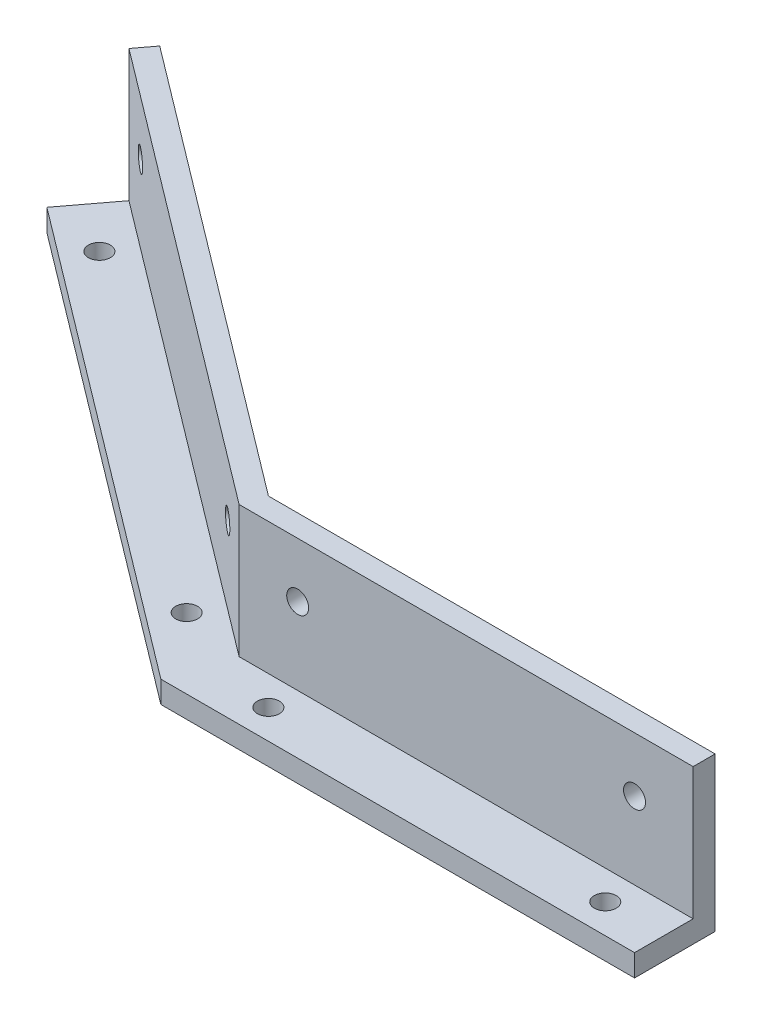
ISO-10303-21;
HEADER;
FILE_DESCRIPTION(('STEP AP214'),'2;1');
FILE_NAME('part.step','',(''),(''),'','','');
FILE_SCHEMA(('AUTOMOTIVE_DESIGN { 1 0 10303 214 1 1 1 1 }'));
ENDSEC;
DATA;
#1=APPLICATION_CONTEXT('core data for automotive mechanical design processes');
#2=APPLICATION_PROTOCOL_DEFINITION('international standard','automotive_design',2000,#1);
#3=PRODUCT_CONTEXT('',#1,'mechanical');
#4=PRODUCT('Part','Part','',(#3));
#5=PRODUCT_RELATED_PRODUCT_CATEGORY('part','',(#4));
#6=PRODUCT_DEFINITION_FORMATION('','',#4);
#7=PRODUCT_DEFINITION_CONTEXT('part definition',#1,'design');
#8=PRODUCT_DEFINITION('design','',#6,#7);
#9=PRODUCT_DEFINITION_SHAPE('','',#8);
#10=(LENGTH_UNIT() NAMED_UNIT(*) SI_UNIT(.MILLI.,.METRE.));
#11=(NAMED_UNIT(*) PLANE_ANGLE_UNIT() SI_UNIT($,.RADIAN.));
#12=(NAMED_UNIT(*) SI_UNIT($,.STERADIAN.) SOLID_ANGLE_UNIT());
#13=UNCERTAINTY_MEASURE_WITH_UNIT(LENGTH_MEASURE(1.E-05),#10,'distance_accuracy_value','');
#14=(GEOMETRIC_REPRESENTATION_CONTEXT(3) GLOBAL_UNCERTAINTY_ASSIGNED_CONTEXT((#13)) GLOBAL_UNIT_ASSIGNED_CONTEXT((#10,
#11,#12)) REPRESENTATION_CONTEXT('',''));
#15=CARTESIAN_POINT('',(0.,0.,0.));
#16=DIRECTION('',(0.,0.,1.));
#17=DIRECTION('',(1.,0.,0.));
#18=AXIS2_PLACEMENT_3D('',#15,#16,#17);
#19=CARTESIAN_POINT('',(0.,3.,0.));
#20=DIRECTION('',(-1.,0.,0.));
#21=DIRECTION('',(0.,0.,1.));
#22=AXIS2_PLACEMENT_3D('',#19,#20,#21);
#23=PLANE('',#22);
#24=DIRECTION('',(0.,0.,-1.));
#25=VECTOR('',#24,1.);
#26=CARTESIAN_POINT('',(0.,0.,0.));
#27=LINE('',#26,#25);
#28=CARTESIAN_POINT('',(0.,0.,8.));
#29=VERTEX_POINT('',#28);
#30=CARTESIAN_POINT('',(0.,0.,-3.));
#31=VERTEX_POINT('',#30);
#32=EDGE_CURVE('E108',#29,#31,#27,.T.);
#33=ORIENTED_EDGE('',*,*,#32,.T.);
#34=DIRECTION('',(0.,-1.,0.));
#35=VECTOR('',#34,1.);
#36=CARTESIAN_POINT('',(0.,21.,-3.));
#37=LINE('',#36,#35);
#38=CARTESIAN_POINT('',(0.,21.,-3.));
#39=VERTEX_POINT('',#38);
#40=EDGE_CURVE('E129',#39,#31,#37,.T.);
#41=ORIENTED_EDGE('',*,*,#40,.F.);
#42=DIRECTION('',(0.,0.,-1.));
#43=VECTOR('',#42,1.);
#44=CARTESIAN_POINT('',(0.,21.,-3.));
#45=LINE('',#44,#43);
#46=CARTESIAN_POINT('',(0.,21.,0.));
#47=VERTEX_POINT('',#46);
#48=EDGE_CURVE('E170',#47,#39,#45,.T.);
#49=ORIENTED_EDGE('',*,*,#48,.F.);
#50=DIRECTION('',(0.,-1.,0.));
#51=VECTOR('',#50,1.);
#52=CARTESIAN_POINT('',(0.,21.,0.));
#53=LINE('',#52,#51);
#54=CARTESIAN_POINT('',(0.,3.,0.));
#55=VERTEX_POINT('',#54);
#56=EDGE_CURVE('E138',#47,#55,#53,.T.);
#57=ORIENTED_EDGE('',*,*,#56,.T.);
#58=DIRECTION('',(0.,0.,-1.));
#59=VECTOR('',#58,1.);
#60=CARTESIAN_POINT('',(0.,3.,0.));
#61=LINE('',#60,#59);
#62=CARTESIAN_POINT('',(0.,3.,8.));
#63=VERTEX_POINT('',#62);
#64=EDGE_CURVE('E77',#63,#55,#61,.T.);
#65=ORIENTED_EDGE('',*,*,#64,.F.);
#66=DIRECTION('',(0.,-1.,0.));
#67=VECTOR('',#66,1.);
#68=CARTESIAN_POINT('',(0.,3.,8.));
#69=LINE('',#68,#67);
#70=EDGE_CURVE('E104',#63,#29,#69,.T.);
#71=ORIENTED_EDGE('',*,*,#70,.T.);
#72=EDGE_LOOP('',(#33,#41,#49,#57,#65,#71));
#73=FACE_BOUND('',#72,.T.);
#74=ADVANCED_FACE('F35',(#73),#23,.F.);
#75=CARTESIAN_POINT('',(-123.446373684317,3.,-46.4041287069077));
#76=DIRECTION('',(0.79800485304308,0.,0.602651022167633));
#77=DIRECTION('',(0.602651022167633,0.,-0.79800485304308));
#78=AXIS2_PLACEMENT_3D('',#75,#76,#77);
#79=PLANE('',#78);
#80=DIRECTION('',(-0.602651022167633,0.,0.79800485304308));
#81=VECTOR('',#80,1.);
#82=CARTESIAN_POINT('',(-123.446373684317,0.,-46.4041287069077));
#83=LINE('',#82,#81);
#84=CARTESIAN_POINT('',(-121.638420617814,0.,-48.7981432660369));
#85=VERTEX_POINT('',#84);
#86=CARTESIAN_POINT('',(-128.267581861658,0.,-40.020089882563));
#87=VERTEX_POINT('',#86);
#88=EDGE_CURVE('E101',#85,#87,#83,.T.);
#89=ORIENTED_EDGE('',*,*,#88,.T.);
#90=DIRECTION('',(0.,-1.,0.));
#91=VECTOR('',#90,1.);
#92=CARTESIAN_POINT('',(-128.267581861658,3.,-40.020089882563));
#93=LINE('',#92,#91);
#94=CARTESIAN_POINT('',(-128.267581861658,3.,-40.020089882563));
#95=VERTEX_POINT('',#94);
#96=EDGE_CURVE('E11',#95,#87,#93,.T.);
#97=ORIENTED_EDGE('',*,*,#96,.F.);
#98=DIRECTION('',(-0.602651022167633,0.,0.79800485304308));
#99=VECTOR('',#98,1.);
#100=CARTESIAN_POINT('',(-123.446373684317,3.,-46.4041287069077));
#101=LINE('',#100,#99);
#102=CARTESIAN_POINT('',(-123.446373684317,3.,-46.4041287069077));
#103=VERTEX_POINT('',#102);
#104=EDGE_CURVE('E87',#103,#95,#101,.T.);
#105=ORIENTED_EDGE('',*,*,#104,.F.);
#106=DIRECTION('',(0.,-1.,0.));
#107=VECTOR('',#106,1.);
#108=CARTESIAN_POINT('',(-123.446373684317,21.,-46.4041287069077));
#109=LINE('',#108,#107);
#110=CARTESIAN_POINT('',(-123.446373684317,21.,-46.4041287069077));
#111=VERTEX_POINT('',#110);
#112=EDGE_CURVE('E159',#111,#103,#109,.T.);
#113=ORIENTED_EDGE('',*,*,#112,.F.);
#114=DIRECTION('',(-0.602651022167628,0.,0.798004853043084));
#115=VECTOR('',#114,1.);
#116=CARTESIAN_POINT('',(-123.446373684317,21.,-46.4041287069077));
#117=LINE('',#116,#115);
#118=CARTESIAN_POINT('',(-121.638420617814,21.,-48.7981432660369));
#119=VERTEX_POINT('',#118);
#120=EDGE_CURVE('E177',#119,#111,#117,.T.);
#121=ORIENTED_EDGE('',*,*,#120,.F.);
#122=DIRECTION('',(0.,-1.,0.));
#123=VECTOR('',#122,1.);
#124=CARTESIAN_POINT('',(-121.638420617814,21.,-48.7981432660369));
#125=LINE('',#124,#123);
#126=EDGE_CURVE('E144',#119,#85,#125,.T.);
#127=ORIENTED_EDGE('',*,*,#126,.T.);
#128=EDGE_LOOP('',(#89,#97,#105,#113,#121,#127));
#129=FACE_BOUND('',#128,.T.);
#130=ADVANCED_FACE('F98',(#129),#79,.F.);
#131=CARTESIAN_POINT('',(-64.6814211147324,3.,8.));
#132=DIRECTION('',(0.602651022167632,0.,-0.79800485304308));
#133=DIRECTION('',(-0.79800485304308,0.,-0.602651022167632));
#134=AXIS2_PLACEMENT_3D('',#131,#132,#133);
#135=PLANE('',#134);
#136=DIRECTION('',(0.79800485304308,0.,0.602651022167632));
#137=VECTOR('',#136,1.);
#138=CARTESIAN_POINT('',(-64.6814211147324,0.,8.));
#139=LINE('',#138,#137);
#140=CARTESIAN_POINT('',(-64.6814211147324,0.,8.));
#141=VERTEX_POINT('',#140);
#142=EDGE_CURVE('E65',#87,#141,#139,.T.);
#143=ORIENTED_EDGE('',*,*,#142,.T.);
#144=DIRECTION('',(0.,-1.,0.));
#145=VECTOR('',#144,1.);
#146=CARTESIAN_POINT('',(-64.6814211147324,3.,8.));
#147=LINE('',#146,#145);
#148=CARTESIAN_POINT('',(-64.6814211147324,3.,8.));
#149=VERTEX_POINT('',#148);
#150=EDGE_CURVE('E43',#149,#141,#147,.T.);
#151=ORIENTED_EDGE('',*,*,#150,.F.);
#152=DIRECTION('',(0.79800485304308,0.,0.602651022167632));
#153=VECTOR('',#152,1.);
#154=CARTESIAN_POINT('',(-64.6814211147324,3.,8.));
#155=LINE('',#154,#153);
#156=EDGE_CURVE('E91',#95,#149,#155,.T.);
#157=ORIENTED_EDGE('',*,*,#156,.F.);
#158=ORIENTED_EDGE('',*,*,#96,.T.);
#159=EDGE_LOOP('',(#143,#151,#157,#158));
#160=FACE_BOUND('',#159,.T.);
#161=ADVANCED_FACE('F102',(#160),#135,.F.);
#162=CARTESIAN_POINT('',(0.,3.,8.));
#163=DIRECTION('',(0.,0.,-1.));
#164=DIRECTION('',(-1.,0.,0.));
#165=AXIS2_PLACEMENT_3D('',#162,#163,#164);
#166=PLANE('',#165);
#167=DIRECTION('',(1.,0.,0.));
#168=VECTOR('',#167,1.);
#169=CARTESIAN_POINT('',(0.,0.,8.));
#170=LINE('',#169,#168);
#171=EDGE_CURVE('E71',#141,#29,#170,.T.);
#172=ORIENTED_EDGE('',*,*,#171,.T.);
#173=ORIENTED_EDGE('',*,*,#70,.F.);
#174=DIRECTION('',(1.,0.,0.));
#175=VECTOR('',#174,1.);
#176=CARTESIAN_POINT('',(0.,3.,8.));
#177=LINE('',#176,#175);
#178=EDGE_CURVE('E51',#149,#63,#177,.T.);
#179=ORIENTED_EDGE('',*,*,#178,.F.);
#180=ORIENTED_EDGE('',*,*,#150,.T.);
#181=EDGE_LOOP('',(#172,#173,#179,#180));
#182=FACE_BOUND('',#181,.T.);
#183=ADVANCED_FACE('F115',(#182),#166,.F.);
#184=CARTESIAN_POINT('',(0.,3.,0.));
#185=DIRECTION('',(0.,-1.,0.));
#186=DIRECTION('',(0.,0.,-1.));
#187=AXIS2_PLACEMENT_3D('',#184,#185,#186);
#188=PLANE('',#187);
#189=CARTESIAN_POINT('',(-119.472938948643,3.,-38.3909011173943));
#190=DIRECTION('',(0.,1.,0.));
#191=DIRECTION('',(0.,0.,1.));
#192=AXIS2_PLACEMENT_3D('',#189,#190,#191);
#193=CIRCLE('',#192,1.5);
#194=CARTESIAN_POINT('',(-119.472938948643,3.,-36.8909011173943));
#195=VERTEX_POINT('',#194);
#196=EDGE_CURVE('E251',#195,#195,#193,.T.);
#197=ORIENTED_EDGE('',*,*,#196,.F.);
#198=EDGE_LOOP('',(#197));
#199=FACE_BOUND('',#198,.T.);
#200=CARTESIAN_POINT('',(-70.7946429130152,3.,-1.62918876516875));
#201=DIRECTION('',(0.,1.,0.));
#202=DIRECTION('',(0.,0.,1.));
#203=AXIS2_PLACEMENT_3D('',#200,#201,#202);
#204=CIRCLE('',#203,1.5);
#205=CARTESIAN_POINT('',(-70.7946429130152,3.,-0.129188765168755));
#206=VERTEX_POINT('',#205);
#207=EDGE_CURVE('E284',#206,#206,#204,.T.);
#208=ORIENTED_EDGE('',*,*,#207,.F.);
#209=EDGE_LOOP('',(#208));
#210=FACE_BOUND('',#209,.T.);
#211=CARTESIAN_POINT('',(-54.,3.,4.));
#212=DIRECTION('',(0.,1.,0.));
#213=DIRECTION('',(0.,0.,1.));
#214=AXIS2_PLACEMENT_3D('',#211,#212,#213);
#215=CIRCLE('',#214,1.5);
#216=CARTESIAN_POINT('',(-54.,3.,5.49999999999999));
#217=VERTEX_POINT('',#216);
#218=EDGE_CURVE('E278',#217,#217,#215,.T.);
#219=ORIENTED_EDGE('',*,*,#218,.F.);
#220=EDGE_LOOP('',(#219));
#221=FACE_BOUND('',#220,.T.);
#222=CARTESIAN_POINT('',(-8.,3.,4.));
#223=DIRECTION('',(0.,1.,0.));
#224=DIRECTION('',(0.,0.,1.));
#225=AXIS2_PLACEMENT_3D('',#222,#223,#224);
#226=CIRCLE('',#225,1.5);
#227=CARTESIAN_POINT('',(-8.,3.,5.5));
#228=VERTEX_POINT('',#227);
#229=EDGE_CURVE('E272',#228,#228,#226,.T.);
#230=ORIENTED_EDGE('',*,*,#229,.F.);
#231=EDGE_LOOP('',(#230));
#232=FACE_BOUND('',#231,.T.);
#233=ORIENTED_EDGE('',*,*,#64,.T.);
#234=DIRECTION('',(-1.,0.,0.));
#235=VECTOR('',#234,1.);
#236=CARTESIAN_POINT('',(0.,3.,0.));
#237=LINE('',#236,#235);
#238=CARTESIAN_POINT('',(-62.,3.,0.));
#239=VERTEX_POINT('',#238);
#240=EDGE_CURVE('E151',#55,#239,#237,.T.);
#241=ORIENTED_EDGE('',*,*,#240,.T.);
#242=DIRECTION('',(-0.79800485304308,0.,-0.602651022167632));
#243=VECTOR('',#242,1.);
#244=CARTESIAN_POINT('',(-62.,3.,0.));
#245=LINE('',#244,#243);
#246=EDGE_CURVE('E93',#239,#103,#245,.T.);
#247=ORIENTED_EDGE('',*,*,#246,.T.);
#248=ORIENTED_EDGE('',*,*,#104,.T.);
#249=ORIENTED_EDGE('',*,*,#156,.T.);
#250=ORIENTED_EDGE('',*,*,#178,.T.);
#251=EDGE_LOOP('',(#233,#241,#247,#248,#249,#250));
#252=FACE_BOUND('',#251,.T.);
#253=ADVANCED_FACE('F89',(#199,#210,#221,#232,#252),#188,.F.);
#254=CARTESIAN_POINT('',(0.,0.,0.));
#255=DIRECTION('',(0.,-1.,0.));
#256=DIRECTION('',(0.,0.,-1.));
#257=AXIS2_PLACEMENT_3D('',#254,#255,#256);
#258=PLANE('',#257);
#259=CARTESIAN_POINT('',(-119.472938948643,0.,-38.3909011173943));
#260=DIRECTION('',(0.,1.,0.));
#261=DIRECTION('',(0.,0.,1.));
#262=AXIS2_PLACEMENT_3D('',#259,#260,#261);
#263=CIRCLE('',#262,1.5);
#264=CARTESIAN_POINT('',(-119.472938948643,0.,-36.8909011173943));
#265=VERTEX_POINT('',#264);
#266=EDGE_CURVE('E246',#265,#265,#263,.T.);
#267=ORIENTED_EDGE('',*,*,#266,.T.);
#268=EDGE_LOOP('',(#267));
#269=FACE_BOUND('',#268,.T.);
#270=CARTESIAN_POINT('',(-70.7946429130152,0.,-1.62918876516875));
#271=DIRECTION('',(0.,1.,0.));
#272=DIRECTION('',(0.,0.,1.));
#273=AXIS2_PLACEMENT_3D('',#270,#271,#272);
#274=CIRCLE('',#273,1.5);
#275=CARTESIAN_POINT('',(-70.7946429130152,0.,-0.129188765168755));
#276=VERTEX_POINT('',#275);
#277=EDGE_CURVE('E287',#276,#276,#274,.T.);
#278=ORIENTED_EDGE('',*,*,#277,.T.);
#279=EDGE_LOOP('',(#278));
#280=FACE_BOUND('',#279,.T.);
#281=CARTESIAN_POINT('',(-54.,0.,4.));
#282=DIRECTION('',(0.,1.,0.));
#283=DIRECTION('',(0.,0.,1.));
#284=AXIS2_PLACEMENT_3D('',#281,#282,#283);
#285=CIRCLE('',#284,1.5);
#286=CARTESIAN_POINT('',(-54.,0.,5.49999999999999));
#287=VERTEX_POINT('',#286);
#288=EDGE_CURVE('E281',#287,#287,#285,.T.);
#289=ORIENTED_EDGE('',*,*,#288,.T.);
#290=EDGE_LOOP('',(#289));
#291=FACE_BOUND('',#290,.T.);
#292=CARTESIAN_POINT('',(-8.,0.,4.));
#293=DIRECTION('',(0.,1.,0.));
#294=DIRECTION('',(0.,0.,1.));
#295=AXIS2_PLACEMENT_3D('',#292,#293,#294);
#296=CIRCLE('',#295,1.5);
#297=CARTESIAN_POINT('',(-8.,0.,5.5));
#298=VERTEX_POINT('',#297);
#299=EDGE_CURVE('E275',#298,#298,#296,.T.);
#300=ORIENTED_EDGE('',*,*,#299,.T.);
#301=EDGE_LOOP('',(#300));
#302=FACE_BOUND('',#301,.T.);
#303=ORIENTED_EDGE('',*,*,#88,.F.);
#304=DIRECTION('',(-0.798004853043076,0.,-0.602651022167638));
#305=VECTOR('',#304,1.);
#306=CARTESIAN_POINT('',(-121.638420617814,0.,-48.7981432660369));
#307=LINE('',#306,#305);
#308=CARTESIAN_POINT('',(-60.9944670819762,0.,-3.));
#309=VERTEX_POINT('',#308);
#310=EDGE_CURVE('E178',#309,#85,#307,.T.);
#311=ORIENTED_EDGE('',*,*,#310,.F.);
#312=DIRECTION('',(-1.,0.,0.));
#313=VECTOR('',#312,1.);
#314=CARTESIAN_POINT('',(-60.9944670819762,0.,-3.));
#315=LINE('',#314,#313);
#316=EDGE_CURVE('E123',#31,#309,#315,.T.);
#317=ORIENTED_EDGE('',*,*,#316,.F.);
#318=ORIENTED_EDGE('',*,*,#32,.F.);
#319=ORIENTED_EDGE('',*,*,#171,.F.);
#320=ORIENTED_EDGE('',*,*,#142,.F.);
#321=EDGE_LOOP('',(#303,#311,#317,#318,#319,#320));
#322=FACE_BOUND('',#321,.T.);
#323=ADVANCED_FACE('F118',(#269,#280,#291,#302,#322),#258,.T.);
#324=CARTESIAN_POINT('',(-62.,21.,0.));
#325=DIRECTION('',(0.602651022167632,0.,-0.79800485304308));
#326=DIRECTION('',(-0.79800485304308,0.,-0.602651022167632));
#327=AXIS2_PLACEMENT_3D('',#324,#325,#326);
#328=PLANE('',#327);
#329=CARTESIAN_POINT('',(-117.062334859972,13.5,-41.5829205295666));
#330=DIRECTION('',(-0.602651022167632,0.,0.79800485304308));
#331=DIRECTION('',(0.79800485304308,0.,0.602651022167632));
#332=AXIS2_PLACEMENT_3D('',#329,#330,#331);
#333=CIRCLE('',#332,1.49999999999999);
#334=CARTESIAN_POINT('',(-115.865327580408,13.5,-40.6789439963152));
#335=VERTEX_POINT('',#334);
#336=EDGE_CURVE('E257',#335,#335,#333,.T.);
#337=ORIENTED_EDGE('',*,*,#336,.F.);
#338=EDGE_LOOP('',(#337));
#339=FACE_BOUND('',#338,.T.);
#340=CARTESIAN_POINT('',(-68.3840388243446,13.5,-4.82120817734105));
#341=DIRECTION('',(-0.602651022167632,0.,0.79800485304308));
#342=DIRECTION('',(0.79800485304308,0.,0.602651022167632));
#343=AXIS2_PLACEMENT_3D('',#340,#341,#342);
#344=CIRCLE('',#343,1.49999999999999);
#345=CARTESIAN_POINT('',(-67.18703154478,13.5,-3.9172316440896));
#346=VERTEX_POINT('',#345);
#347=EDGE_CURVE('E263',#346,#346,#344,.T.);
#348=ORIENTED_EDGE('',*,*,#347,.F.);
#349=EDGE_LOOP('',(#348));
#350=FACE_BOUND('',#349,.T.);
#351=ORIENTED_EDGE('',*,*,#112,.T.);
#352=ORIENTED_EDGE('',*,*,#246,.F.);
#353=DIRECTION('',(0.,-1.,0.));
#354=VECTOR('',#353,1.);
#355=CARTESIAN_POINT('',(-62.,21.,0.));
#356=LINE('',#355,#354);
#357=CARTESIAN_POINT('',(-62.,21.,0.));
#358=VERTEX_POINT('',#357);
#359=EDGE_CURVE('E111',#358,#239,#356,.T.);
#360=ORIENTED_EDGE('',*,*,#359,.F.);
#361=DIRECTION('',(0.79800485304308,0.,0.602651022167632));
#362=VECTOR('',#361,1.);
#363=CARTESIAN_POINT('',(-62.,21.,0.));
#364=LINE('',#363,#362);
#365=EDGE_CURVE('E171',#111,#358,#364,.T.);
#366=ORIENTED_EDGE('',*,*,#365,.F.);
#367=EDGE_LOOP('',(#351,#352,#360,#366));
#368=FACE_BOUND('',#367,.T.);
#369=ADVANCED_FACE('F156',(#339,#350,#368),#328,.F.);
#370=CARTESIAN_POINT('',(0.,21.,0.));
#371=DIRECTION('',(0.,0.,-1.));
#372=DIRECTION('',(-1.,0.,0.));
#373=AXIS2_PLACEMENT_3D('',#370,#371,#372);
#374=PLANE('',#373);
#375=CARTESIAN_POINT('',(-54.,13.5,0.));
#376=DIRECTION('',(0.,0.,1.));
#377=DIRECTION('',(1.,0.,0.));
#378=AXIS2_PLACEMENT_3D('',#375,#376,#377);
#379=CIRCLE('',#378,1.5);
#380=CARTESIAN_POINT('',(-52.5,13.5,0.));
#381=VERTEX_POINT('',#380);
#382=EDGE_CURVE('E240',#381,#381,#379,.T.);
#383=ORIENTED_EDGE('',*,*,#382,.F.);
#384=EDGE_LOOP('',(#383));
#385=FACE_BOUND('',#384,.T.);
#386=CARTESIAN_POINT('',(-8.,13.5,0.));
#387=DIRECTION('',(0.,0.,1.));
#388=DIRECTION('',(1.,0.,0.));
#389=AXIS2_PLACEMENT_3D('',#386,#387,#388);
#390=CIRCLE('',#389,1.5);
#391=CARTESIAN_POINT('',(-6.5,13.5,0.));
#392=VERTEX_POINT('',#391);
#393=EDGE_CURVE('E243',#392,#392,#390,.T.);
#394=ORIENTED_EDGE('',*,*,#393,.F.);
#395=EDGE_LOOP('',(#394));
#396=FACE_BOUND('',#395,.T.);
#397=ORIENTED_EDGE('',*,*,#359,.T.);
#398=ORIENTED_EDGE('',*,*,#240,.F.);
#399=ORIENTED_EDGE('',*,*,#56,.F.);
#400=DIRECTION('',(1.,0.,0.));
#401=VECTOR('',#400,1.);
#402=CARTESIAN_POINT('',(0.,21.,0.));
#403=LINE('',#402,#401);
#404=EDGE_CURVE('E163',#358,#47,#403,.T.);
#405=ORIENTED_EDGE('',*,*,#404,.F.);
#406=EDGE_LOOP('',(#397,#398,#399,#405));
#407=FACE_BOUND('',#406,.T.);
#408=ADVANCED_FACE('F161',(#385,#396,#407),#374,.F.);
#409=CARTESIAN_POINT('',(-60.9944670819762,21.,-3.));
#410=DIRECTION('',(0.,0.,1.));
#411=DIRECTION('',(1.,0.,0.));
#412=AXIS2_PLACEMENT_3D('',#409,#410,#411);
#413=PLANE('',#412);
#414=CARTESIAN_POINT('',(-54.,13.5,-3.));
#415=DIRECTION('',(0.,0.,1.));
#416=DIRECTION('',(1.,0.,0.));
#417=AXIS2_PLACEMENT_3D('',#414,#415,#416);
#418=CIRCLE('',#417,1.5);
#419=CARTESIAN_POINT('',(-52.5,13.5,-3.));
#420=VERTEX_POINT('',#419);
#421=EDGE_CURVE('E265',#420,#420,#418,.T.);
#422=ORIENTED_EDGE('',*,*,#421,.T.);
#423=EDGE_LOOP('',(#422));
#424=FACE_BOUND('',#423,.T.);
#425=CARTESIAN_POINT('',(-8.,13.5,-3.));
#426=DIRECTION('',(0.,0.,1.));
#427=DIRECTION('',(1.,0.,0.));
#428=AXIS2_PLACEMENT_3D('',#425,#426,#427);
#429=CIRCLE('',#428,1.5);
#430=CARTESIAN_POINT('',(-6.5,13.5,-3.));
#431=VERTEX_POINT('',#430);
#432=EDGE_CURVE('E245',#431,#431,#429,.T.);
#433=ORIENTED_EDGE('',*,*,#432,.T.);
#434=EDGE_LOOP('',(#433));
#435=FACE_BOUND('',#434,.T.);
#436=ORIENTED_EDGE('',*,*,#40,.T.);
#437=ORIENTED_EDGE('',*,*,#316,.T.);
#438=DIRECTION('',(0.,-1.,0.));
#439=VECTOR('',#438,1.);
#440=CARTESIAN_POINT('',(-60.9944670819762,21.,-3.));
#441=LINE('',#440,#439);
#442=CARTESIAN_POINT('',(-60.9944670819762,21.,-3.));
#443=VERTEX_POINT('',#442);
#444=EDGE_CURVE('E139',#443,#309,#441,.T.);
#445=ORIENTED_EDGE('',*,*,#444,.F.);
#446=DIRECTION('',(-1.,0.,0.));
#447=VECTOR('',#446,1.);
#448=CARTESIAN_POINT('',(-60.9944670819762,21.,-3.));
#449=LINE('',#448,#447);
#450=EDGE_CURVE('E137',#39,#443,#449,.T.);
#451=ORIENTED_EDGE('',*,*,#450,.F.);
#452=EDGE_LOOP('',(#436,#437,#445,#451));
#453=FACE_BOUND('',#452,.T.);
#454=ADVANCED_FACE('F134',(#424,#435,#453),#413,.F.);
#455=CARTESIAN_POINT('',(-121.638420617814,21.,-48.7981432660369));
#456=DIRECTION('',(-0.602651022167638,0.,0.798004853043076));
#457=DIRECTION('',(0.798004853043076,0.,0.602651022167638));
#458=AXIS2_PLACEMENT_3D('',#455,#456,#457);
#459=PLANE('',#458);
#460=CARTESIAN_POINT('',(-115.25438179347,13.5,-43.9769350886959));
#461=DIRECTION('',(-0.602651022167632,0.,0.79800485304308));
#462=DIRECTION('',(0.79800485304308,0.,0.602651022167632));
#463=AXIS2_PLACEMENT_3D('',#460,#461,#462);
#464=CIRCLE('',#463,1.49999999999999);
#465=CARTESIAN_POINT('',(-114.057374513905,13.5,-43.0729585554444));
#466=VERTEX_POINT('',#465);
#467=EDGE_CURVE('E255',#466,#466,#464,.T.);
#468=ORIENTED_EDGE('',*,*,#467,.T.);
#469=EDGE_LOOP('',(#468));
#470=FACE_BOUND('',#469,.T.);
#471=CARTESIAN_POINT('',(-66.5760857578417,13.5,-7.21522273647029));
#472=DIRECTION('',(-0.602651022167632,0.,0.79800485304308));
#473=DIRECTION('',(0.79800485304308,0.,0.602651022167632));
#474=AXIS2_PLACEMENT_3D('',#471,#472,#473);
#475=CIRCLE('',#474,1.49999999999999);
#476=CARTESIAN_POINT('',(-65.3790784782771,13.5,-6.31124620321884));
#477=VERTEX_POINT('',#476);
#478=EDGE_CURVE('E260',#477,#477,#475,.T.);
#479=ORIENTED_EDGE('',*,*,#478,.T.);
#480=EDGE_LOOP('',(#479));
#481=FACE_BOUND('',#480,.T.);
#482=ORIENTED_EDGE('',*,*,#444,.T.);
#483=ORIENTED_EDGE('',*,*,#310,.T.);
#484=ORIENTED_EDGE('',*,*,#126,.F.);
#485=DIRECTION('',(-0.798004853043076,0.,-0.602651022167638));
#486=VECTOR('',#485,1.);
#487=CARTESIAN_POINT('',(-121.638420617814,21.,-48.7981432660369));
#488=LINE('',#487,#486);
#489=EDGE_CURVE('E186',#443,#119,#488,.T.);
#490=ORIENTED_EDGE('',*,*,#489,.F.);
#491=EDGE_LOOP('',(#482,#483,#484,#490));
#492=FACE_BOUND('',#491,.T.);
#493=ADVANCED_FACE('F194',(#470,#481,#492),#459,.F.);
#494=CARTESIAN_POINT('',(0.,21.,0.));
#495=DIRECTION('',(0.,-1.,0.));
#496=DIRECTION('',(0.,0.,-1.));
#497=AXIS2_PLACEMENT_3D('',#494,#495,#496);
#498=PLANE('',#497);
#499=ORIENTED_EDGE('',*,*,#365,.T.);
#500=ORIENTED_EDGE('',*,*,#404,.T.);
#501=ORIENTED_EDGE('',*,*,#48,.T.);
#502=ORIENTED_EDGE('',*,*,#450,.T.);
#503=ORIENTED_EDGE('',*,*,#489,.T.);
#504=ORIENTED_EDGE('',*,*,#120,.T.);
#505=EDGE_LOOP('',(#499,#500,#501,#502,#503,#504));
#506=FACE_BOUND('',#505,.T.);
#507=ADVANCED_FACE('F174',(#506),#498,.F.);
#508=CARTESIAN_POINT('',(-66.5760857578417,13.5,-7.21522273647029));
#509=DIRECTION('',(-0.602651022167632,0.,0.79800485304308));
#510=DIRECTION('',(0.79800485304308,0.,0.602651022167632));
#511=AXIS2_PLACEMENT_3D('',#508,#509,#510);
#512=CYLINDRICAL_SURFACE('',#511,1.49999999999999);
#513=ORIENTED_EDGE('',*,*,#478,.F.);
#514=EDGE_LOOP('',(#513));
#515=FACE_BOUND('',#514,.T.);
#516=ORIENTED_EDGE('',*,*,#347,.T.);
#517=EDGE_LOOP('',(#516));
#518=FACE_BOUND('',#517,.T.);
#519=ADVANCED_FACE('F207',(#515,#518),#512,.F.);
#520=CARTESIAN_POINT('',(-115.25438179347,13.5,-43.9769350886959));
#521=DIRECTION('',(-0.602651022167632,0.,0.79800485304308));
#522=DIRECTION('',(0.79800485304308,0.,0.602651022167632));
#523=AXIS2_PLACEMENT_3D('',#520,#521,#522);
#524=CYLINDRICAL_SURFACE('',#523,1.49999999999999);
#525=ORIENTED_EDGE('',*,*,#467,.F.);
#526=EDGE_LOOP('',(#525));
#527=FACE_BOUND('',#526,.T.);
#528=ORIENTED_EDGE('',*,*,#336,.T.);
#529=EDGE_LOOP('',(#528));
#530=FACE_BOUND('',#529,.T.);
#531=ADVANCED_FACE('F322',(#527,#530),#524,.F.);
#532=CARTESIAN_POINT('',(-8.,13.5,-3.));
#533=DIRECTION('',(0.,0.,1.));
#534=DIRECTION('',(1.,0.,0.));
#535=AXIS2_PLACEMENT_3D('',#532,#533,#534);
#536=CYLINDRICAL_SURFACE('',#535,1.5);
#537=ORIENTED_EDGE('',*,*,#432,.F.);
#538=EDGE_LOOP('',(#537));
#539=FACE_BOUND('',#538,.T.);
#540=ORIENTED_EDGE('',*,*,#393,.T.);
#541=EDGE_LOOP('',(#540));
#542=FACE_BOUND('',#541,.T.);
#543=ADVANCED_FACE('F314',(#539,#542),#536,.F.);
#544=CARTESIAN_POINT('',(-54.,13.5,-3.));
#545=DIRECTION('',(0.,0.,1.));
#546=DIRECTION('',(1.,0.,0.));
#547=AXIS2_PLACEMENT_3D('',#544,#545,#546);
#548=CYLINDRICAL_SURFACE('',#547,1.5);
#549=ORIENTED_EDGE('',*,*,#421,.F.);
#550=EDGE_LOOP('',(#549));
#551=FACE_BOUND('',#550,.T.);
#552=ORIENTED_EDGE('',*,*,#382,.T.);
#553=EDGE_LOOP('',(#552));
#554=FACE_BOUND('',#553,.T.);
#555=ADVANCED_FACE('F304',(#551,#554),#548,.F.);
#556=CARTESIAN_POINT('',(-8.,0.,4.));
#557=DIRECTION('',(0.,1.,0.));
#558=DIRECTION('',(0.,0.,1.));
#559=AXIS2_PLACEMENT_3D('',#556,#557,#558);
#560=CYLINDRICAL_SURFACE('',#559,1.5);
#561=ORIENTED_EDGE('',*,*,#299,.F.);
#562=EDGE_LOOP('',(#561));
#563=FACE_BOUND('',#562,.T.);
#564=ORIENTED_EDGE('',*,*,#229,.T.);
#565=EDGE_LOOP('',(#564));
#566=FACE_BOUND('',#565,.T.);
#567=ADVANCED_FACE('F301',(#563,#566),#560,.F.);
#568=CARTESIAN_POINT('',(-54.,0.,4.));
#569=DIRECTION('',(0.,1.,0.));
#570=DIRECTION('',(0.,0.,1.));
#571=AXIS2_PLACEMENT_3D('',#568,#569,#570);
#572=CYLINDRICAL_SURFACE('',#571,1.5);
#573=ORIENTED_EDGE('',*,*,#288,.F.);
#574=EDGE_LOOP('',(#573));
#575=FACE_BOUND('',#574,.T.);
#576=ORIENTED_EDGE('',*,*,#218,.T.);
#577=EDGE_LOOP('',(#576));
#578=FACE_BOUND('',#577,.T.);
#579=ADVANCED_FACE('F303',(#575,#578),#572,.F.);
#580=CARTESIAN_POINT('',(-70.7946429130152,0.,-1.62918876516875));
#581=DIRECTION('',(0.,1.,0.));
#582=DIRECTION('',(0.,0.,1.));
#583=AXIS2_PLACEMENT_3D('',#580,#581,#582);
#584=CYLINDRICAL_SURFACE('',#583,1.5);
#585=ORIENTED_EDGE('',*,*,#277,.F.);
#586=EDGE_LOOP('',(#585));
#587=FACE_BOUND('',#586,.T.);
#588=ORIENTED_EDGE('',*,*,#207,.T.);
#589=EDGE_LOOP('',(#588));
#590=FACE_BOUND('',#589,.T.);
#591=ADVANCED_FACE('F311',(#587,#590),#584,.F.);
#592=CARTESIAN_POINT('',(-119.472938948643,0.,-38.3909011173943));
#593=DIRECTION('',(0.,1.,0.));
#594=DIRECTION('',(0.,0.,1.));
#595=AXIS2_PLACEMENT_3D('',#592,#593,#594);
#596=CYLINDRICAL_SURFACE('',#595,1.5);
#597=ORIENTED_EDGE('',*,*,#266,.F.);
#598=EDGE_LOOP('',(#597));
#599=FACE_BOUND('',#598,.T.);
#600=ORIENTED_EDGE('',*,*,#196,.T.);
#601=EDGE_LOOP('',(#600));
#602=FACE_BOUND('',#601,.T.);
#603=ADVANCED_FACE('F293',(#599,#602),#596,.F.);
#604=CLOSED_SHELL('',(#74,#130,#161,#183,#253,#323,#369,#408,#454,#493,#507,#519,#531,#543,#555,
#567,#579,#591,#603));
#605=MANIFOLD_SOLID_BREP('B2',#604);
#606=ADVANCED_BREP_SHAPE_REPRESENTATION('',(#18,#605),#14);
#607=SHAPE_DEFINITION_REPRESENTATION(#9,#606);
ENDSEC;
END-ISO-10303-21;
